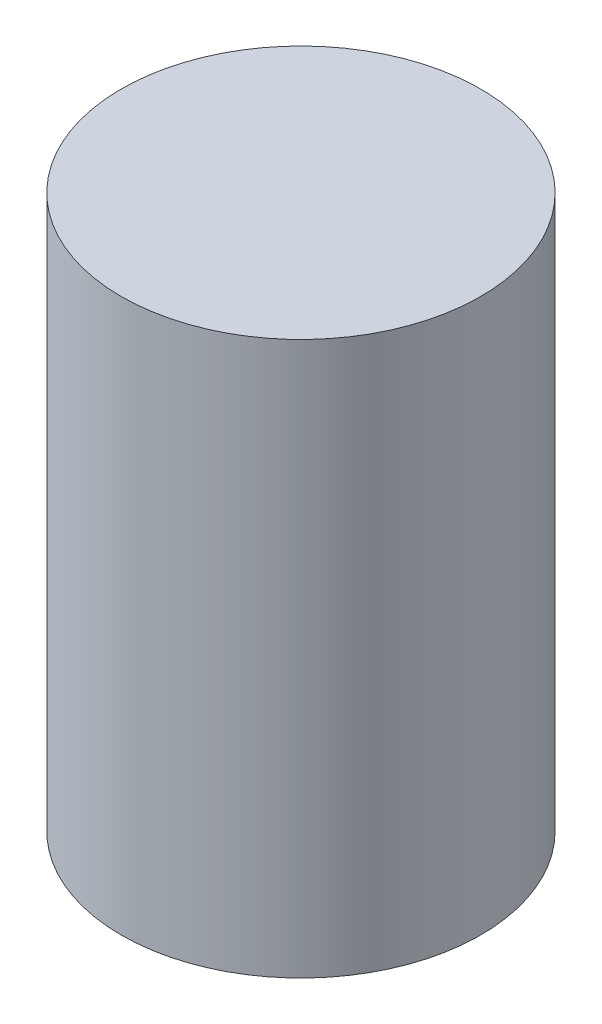
ISO-10303-21;
HEADER;
FILE_DESCRIPTION(('STEP AP214'),'2;1');
FILE_NAME('part.step','',(''),(''),'','','');
FILE_SCHEMA(('AUTOMOTIVE_DESIGN { 1 0 10303 214 1 1 1 1 }'));
ENDSEC;
DATA;
#1=APPLICATION_CONTEXT('core data for automotive mechanical design processes');
#2=APPLICATION_PROTOCOL_DEFINITION('international standard','automotive_design',2000,#1);
#3=PRODUCT_CONTEXT('',#1,'mechanical');
#4=PRODUCT('Part','Part','',(#3));
#5=PRODUCT_RELATED_PRODUCT_CATEGORY('part','',(#4));
#6=PRODUCT_DEFINITION_FORMATION('','',#4);
#7=PRODUCT_DEFINITION_CONTEXT('part definition',#1,'design');
#8=PRODUCT_DEFINITION('design','',#6,#7);
#9=PRODUCT_DEFINITION_SHAPE('','',#8);
#10=(LENGTH_UNIT() NAMED_UNIT(*) SI_UNIT(.MILLI.,.METRE.));
#11=(NAMED_UNIT(*) PLANE_ANGLE_UNIT() SI_UNIT($,.RADIAN.));
#12=(NAMED_UNIT(*) SI_UNIT($,.STERADIAN.) SOLID_ANGLE_UNIT());
#13=UNCERTAINTY_MEASURE_WITH_UNIT(LENGTH_MEASURE(1.E-05),#10,'distance_accuracy_value','');
#14=(GEOMETRIC_REPRESENTATION_CONTEXT(3) GLOBAL_UNCERTAINTY_ASSIGNED_CONTEXT((#13)) GLOBAL_UNIT_ASSIGNED_CONTEXT((#10,
#11,#12)) REPRESENTATION_CONTEXT('',''));
#15=CARTESIAN_POINT('',(0.,0.,0.));
#16=DIRECTION('',(0.,0.,1.));
#17=DIRECTION('',(1.,0.,0.));
#18=AXIS2_PLACEMENT_3D('',#15,#16,#17);
#19=CARTESIAN_POINT('',(0.,12.,0.));
#20=DIRECTION('',(0.,-1.,0.));
#21=DIRECTION('',(0.,0.,-1.));
#22=AXIS2_PLACEMENT_3D('',#19,#20,#21);
#23=CYLINDRICAL_SURFACE('',#22,3.9);
#24=CARTESIAN_POINT('',(0.,12.,0.));
#25=DIRECTION('',(0.,1.,0.));
#26=DIRECTION('',(0.,0.,1.));
#27=AXIS2_PLACEMENT_3D('',#24,#25,#26);
#28=CIRCLE('',#27,3.9);
#29=CARTESIAN_POINT('',(0.,12.,3.9));
#30=VERTEX_POINT('',#29);
#31=EDGE_CURVE('E10',#30,#30,#28,.T.);
#32=ORIENTED_EDGE('',*,*,#31,.F.);
#33=EDGE_LOOP('',(#32));
#34=FACE_BOUND('',#33,.T.);
#35=CARTESIAN_POINT('',(0.,0.,0.));
#36=DIRECTION('',(0.,1.,0.));
#37=DIRECTION('',(0.,0.,1.));
#38=AXIS2_PLACEMENT_3D('',#35,#36,#37);
#39=CIRCLE('',#38,3.9);
#40=CARTESIAN_POINT('',(0.,0.,3.9));
#41=VERTEX_POINT('',#40);
#42=EDGE_CURVE('E41',#41,#41,#39,.T.);
#43=ORIENTED_EDGE('',*,*,#42,.T.);
#44=EDGE_LOOP('',(#43));
#45=FACE_BOUND('',#44,.T.);
#46=ADVANCED_FACE('F38',(#34,#45),#23,.T.);
#47=CARTESIAN_POINT('',(0.,12.,0.));
#48=DIRECTION('',(0.,1.,0.));
#49=DIRECTION('',(0.,0.,1.));
#50=AXIS2_PLACEMENT_3D('',#47,#48,#49);
#51=PLANE('',#50);
#52=ORIENTED_EDGE('',*,*,#31,.T.);
#53=EDGE_LOOP('',(#52));
#54=FACE_BOUND('',#53,.T.);
#55=ADVANCED_FACE('F53',(#54),#51,.T.);
#56=CARTESIAN_POINT('',(0.,0.,0.));
#57=DIRECTION('',(0.,1.,0.));
#58=DIRECTION('',(0.,0.,1.));
#59=AXIS2_PLACEMENT_3D('',#56,#57,#58);
#60=PLANE('',#59);
#61=ORIENTED_EDGE('',*,*,#42,.F.);
#62=EDGE_LOOP('',(#61));
#63=FACE_BOUND('',#62,.T.);
#64=ADVANCED_FACE('F51',(#63),#60,.F.);
#65=CLOSED_SHELL('',(#46,#55,#64));
#66=MANIFOLD_SOLID_BREP('B2',#65);
#67=ADVANCED_BREP_SHAPE_REPRESENTATION('',(#18,#66),#14);
#68=SHAPE_DEFINITION_REPRESENTATION(#9,#67);
ENDSEC;
END-ISO-10303-21;
